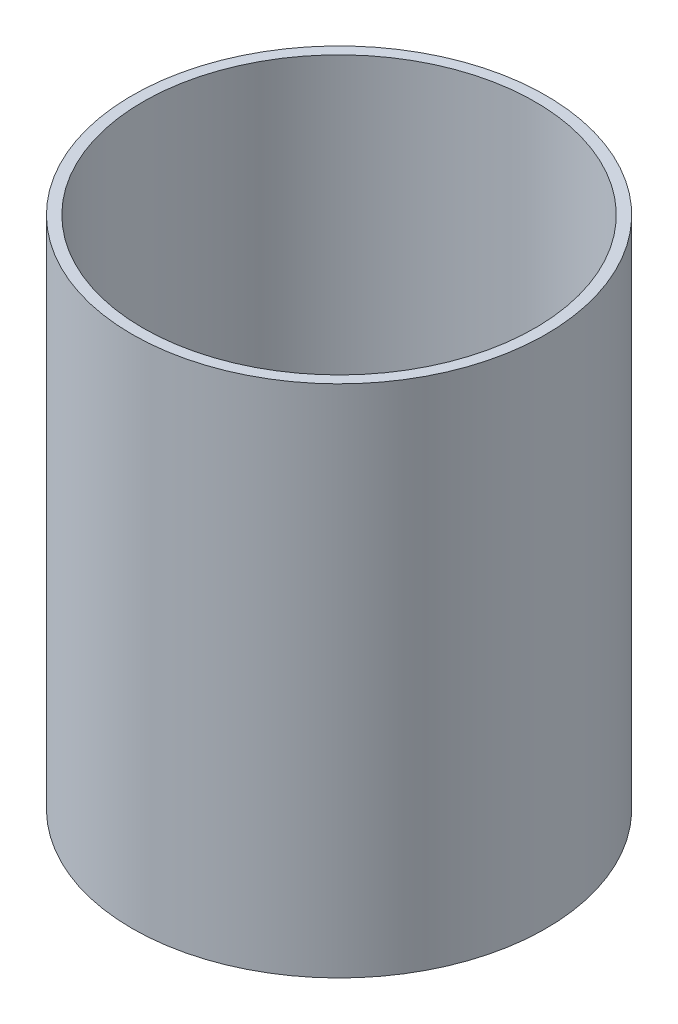
ISO-10303-21;
HEADER;
FILE_DESCRIPTION(('STEP AP214'),'2;1');
FILE_NAME('part.step','',(''),(''),'','','');
FILE_SCHEMA(('AUTOMOTIVE_DESIGN { 1 0 10303 214 1 1 1 1 }'));
ENDSEC;
DATA;
#1=APPLICATION_CONTEXT('core data for automotive mechanical design processes');
#2=APPLICATION_PROTOCOL_DEFINITION('international standard','automotive_design',2000,#1);
#3=PRODUCT_CONTEXT('',#1,'mechanical');
#4=PRODUCT('Part','Part','',(#3));
#5=PRODUCT_RELATED_PRODUCT_CATEGORY('part','',(#4));
#6=PRODUCT_DEFINITION_FORMATION('','',#4);
#7=PRODUCT_DEFINITION_CONTEXT('part definition',#1,'design');
#8=PRODUCT_DEFINITION('design','',#6,#7);
#9=PRODUCT_DEFINITION_SHAPE('','',#8);
#10=(LENGTH_UNIT() NAMED_UNIT(*) SI_UNIT(.MILLI.,.METRE.));
#11=(NAMED_UNIT(*) PLANE_ANGLE_UNIT() SI_UNIT($,.RADIAN.));
#12=(NAMED_UNIT(*) SI_UNIT($,.STERADIAN.) SOLID_ANGLE_UNIT());
#13=UNCERTAINTY_MEASURE_WITH_UNIT(LENGTH_MEASURE(1.E-05),#10,'distance_accuracy_value','');
#14=(GEOMETRIC_REPRESENTATION_CONTEXT(3) GLOBAL_UNCERTAINTY_ASSIGNED_CONTEXT((#13)) GLOBAL_UNIT_ASSIGNED_CONTEXT((#10,
#11,#12)) REPRESENTATION_CONTEXT('',''));
#15=CARTESIAN_POINT('',(0.,0.,0.));
#16=DIRECTION('',(0.,0.,1.));
#17=DIRECTION('',(1.,0.,0.));
#18=AXIS2_PLACEMENT_3D('',#15,#16,#17);
#19=CARTESIAN_POINT('',(0.,150.,0.));
#20=DIRECTION('',(0.,1.,0.));
#21=DIRECTION('',(0.,0.,1.));
#22=AXIS2_PLACEMENT_3D('',#19,#20,#21);
#23=PLANE('',#22);
#24=CARTESIAN_POINT('',(0.,150.,0.));
#25=DIRECTION('',(0.,1.,0.));
#26=DIRECTION('',(0.,0.,1.));
#27=AXIS2_PLACEMENT_3D('',#24,#25,#26);
#28=CIRCLE('',#27,60.325);
#29=CARTESIAN_POINT('',(0.,150.,60.325));
#30=VERTEX_POINT('',#29);
#31=EDGE_CURVE('E10',#30,#30,#28,.T.);
#32=ORIENTED_EDGE('',*,*,#31,.T.);
#33=EDGE_LOOP('',(#32));
#34=FACE_BOUND('',#33,.T.);
#35=CARTESIAN_POINT('',(0.,150.,0.));
#36=DIRECTION('',(0.,1.,0.));
#37=DIRECTION('',(0.,0.,1.));
#38=AXIS2_PLACEMENT_3D('',#35,#36,#37);
#39=CIRCLE('',#38,57.15);
#40=CARTESIAN_POINT('',(0.,150.,57.15));
#41=VERTEX_POINT('',#40);
#42=EDGE_CURVE('E42',#41,#41,#39,.T.);
#43=ORIENTED_EDGE('',*,*,#42,.F.);
#44=EDGE_LOOP('',(#43));
#45=FACE_BOUND('',#44,.T.);
#46=ADVANCED_FACE('F31',(#34,#45),#23,.T.);
#47=CARTESIAN_POINT('',(0.,0.,0.));
#48=DIRECTION('',(0.,1.,0.));
#49=DIRECTION('',(0.,0.,1.));
#50=AXIS2_PLACEMENT_3D('',#47,#48,#49);
#51=PLANE('',#50);
#52=CARTESIAN_POINT('',(0.,0.,0.));
#53=DIRECTION('',(0.,1.,0.));
#54=DIRECTION('',(0.,0.,1.));
#55=AXIS2_PLACEMENT_3D('',#52,#53,#54);
#56=CIRCLE('',#55,60.325);
#57=CARTESIAN_POINT('',(0.,0.,60.325));
#58=VERTEX_POINT('',#57);
#59=EDGE_CURVE('E35',#58,#58,#56,.T.);
#60=ORIENTED_EDGE('',*,*,#59,.F.);
#61=EDGE_LOOP('',(#60));
#62=FACE_BOUND('',#61,.T.);
#63=CARTESIAN_POINT('',(0.,0.,0.));
#64=DIRECTION('',(0.,1.,0.));
#65=DIRECTION('',(0.,0.,1.));
#66=AXIS2_PLACEMENT_3D('',#63,#64,#65);
#67=CIRCLE('',#66,57.15);
#68=CARTESIAN_POINT('',(0.,0.,57.15));
#69=VERTEX_POINT('',#68);
#70=EDGE_CURVE('E44',#69,#69,#67,.T.);
#71=ORIENTED_EDGE('',*,*,#70,.T.);
#72=EDGE_LOOP('',(#71));
#73=FACE_BOUND('',#72,.T.);
#74=ADVANCED_FACE('F54',(#62,#73),#51,.F.);
#75=CARTESIAN_POINT('',(0.,150.,0.));
#76=DIRECTION('',(0.,-1.,0.));
#77=DIRECTION('',(0.,0.,-1.));
#78=AXIS2_PLACEMENT_3D('',#75,#76,#77);
#79=CYLINDRICAL_SURFACE('',#78,60.325);
#80=ORIENTED_EDGE('',*,*,#31,.F.);
#81=EDGE_LOOP('',(#80));
#82=FACE_BOUND('',#81,.T.);
#83=ORIENTED_EDGE('',*,*,#59,.T.);
#84=EDGE_LOOP('',(#83));
#85=FACE_BOUND('',#84,.T.);
#86=ADVANCED_FACE('F33',(#82,#85),#79,.T.);
#87=CARTESIAN_POINT('',(0.,150.,0.));
#88=DIRECTION('',(0.,-1.,0.));
#89=DIRECTION('',(0.,0.,-1.));
#90=AXIS2_PLACEMENT_3D('',#87,#88,#89);
#91=CYLINDRICAL_SURFACE('',#90,57.15);
#92=ORIENTED_EDGE('',*,*,#42,.T.);
#93=EDGE_LOOP('',(#92));
#94=FACE_BOUND('',#93,.T.);
#95=ORIENTED_EDGE('',*,*,#70,.F.);
#96=EDGE_LOOP('',(#95));
#97=FACE_BOUND('',#96,.T.);
#98=ADVANCED_FACE('F50',(#94,#97),#91,.F.);
#99=CLOSED_SHELL('',(#46,#74,#86,#98));
#100=MANIFOLD_SOLID_BREP('B2',#99);
#101=ADVANCED_BREP_SHAPE_REPRESENTATION('',(#18,#100),#14);
#102=SHAPE_DEFINITION_REPRESENTATION(#9,#101);
ENDSEC;
END-ISO-10303-21;
